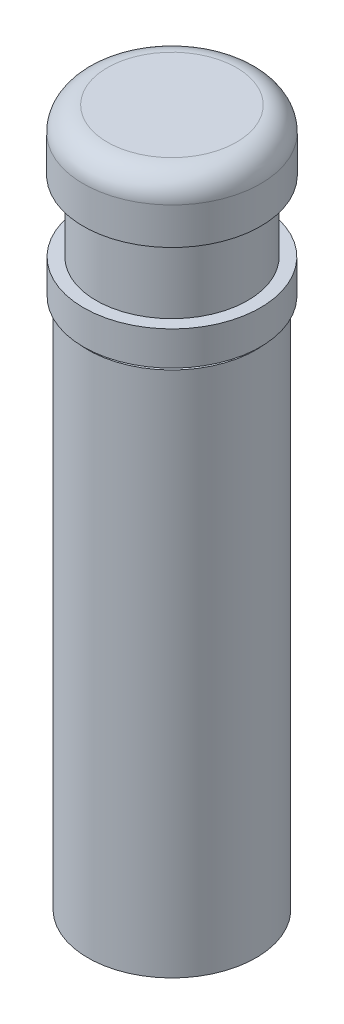
ISO-10303-21;
HEADER;
FILE_DESCRIPTION(('STEP AP214'),'2;1');
FILE_NAME('part.step','',(''),(''),'','','');
FILE_SCHEMA(('AUTOMOTIVE_DESIGN { 1 0 10303 214 1 1 1 1 }'));
ENDSEC;
DATA;
#1=APPLICATION_CONTEXT('core data for automotive mechanical design processes');
#2=APPLICATION_PROTOCOL_DEFINITION('international standard','automotive_design',2000,#1);
#3=PRODUCT_CONTEXT('',#1,'mechanical');
#4=PRODUCT('Part','Part','',(#3));
#5=PRODUCT_RELATED_PRODUCT_CATEGORY('part','',(#4));
#6=PRODUCT_DEFINITION_FORMATION('','',#4);
#7=PRODUCT_DEFINITION_CONTEXT('part definition',#1,'design');
#8=PRODUCT_DEFINITION('design','',#6,#7);
#9=PRODUCT_DEFINITION_SHAPE('','',#8);
#10=(LENGTH_UNIT() NAMED_UNIT(*) SI_UNIT(.MILLI.,.METRE.));
#11=(NAMED_UNIT(*) PLANE_ANGLE_UNIT() SI_UNIT($,.RADIAN.));
#12=(NAMED_UNIT(*) SI_UNIT($,.STERADIAN.) SOLID_ANGLE_UNIT());
#13=UNCERTAINTY_MEASURE_WITH_UNIT(LENGTH_MEASURE(1.E-05),#10,'distance_accuracy_value','');
#14=(GEOMETRIC_REPRESENTATION_CONTEXT(3) GLOBAL_UNCERTAINTY_ASSIGNED_CONTEXT((#13)) GLOBAL_UNIT_ASSIGNED_CONTEXT((#10,
#11,#12)) REPRESENTATION_CONTEXT('',''));
#15=CARTESIAN_POINT('',(0.,0.,0.));
#16=DIRECTION('',(0.,0.,1.));
#17=DIRECTION('',(1.,0.,0.));
#18=AXIS2_PLACEMENT_3D('',#15,#16,#17);
#19=CARTESIAN_POINT('',(0.,58.,5.37817102384318));
#20=DIRECTION('',(0.,-1.,0.));
#21=DIRECTION('',(0.,0.,-1.));
#22=AXIS2_PLACEMENT_3D('',#19,#20,#21);
#23=PLANE('',#22);
#24=CARTESIAN_POINT('',(0.,58.,0.));
#25=DIRECTION('',(0.,-1.,0.));
#26=DIRECTION('',(0.,0.,-1.));
#27=AXIS2_PLACEMENT_3D('',#24,#25,#26);
#28=CIRCLE('',#27,5.37817102384318);
#29=CARTESIAN_POINT('',(0.,58.,-5.37817102384318));
#30=VERTEX_POINT('',#29);
#31=EDGE_CURVE('E10',#30,#30,#28,.T.);
#32=ORIENTED_EDGE('',*,*,#31,.F.);
#33=EDGE_LOOP('',(#32));
#34=FACE_BOUND('',#33,.T.);
#35=ADVANCED_FACE('F33',(#34),#23,.F.);
#36=CARTESIAN_POINT('',(0.,56.,0.));
#37=DIRECTION('',(0.,-1.,0.));
#38=DIRECTION('',(0.,0.,-1.));
#39=AXIS2_PLACEMENT_3D('',#36,#37,#38);
#40=TOROIDAL_SURFACE('',#39,5.37817102384318,2.);
#41=CARTESIAN_POINT('',(0.,56.,0.));
#42=DIRECTION('',(0.,-1.,0.));
#43=DIRECTION('',(0.,0.,-1.));
#44=AXIS2_PLACEMENT_3D('',#41,#42,#43);
#45=CIRCLE('',#44,7.37817102384318);
#46=CARTESIAN_POINT('',(0.,56.,-7.37817102384318));
#47=VERTEX_POINT('',#46);
#48=EDGE_CURVE('E39',#47,#47,#45,.T.);
#49=ORIENTED_EDGE('',*,*,#48,.F.);
#50=EDGE_LOOP('',(#49));
#51=FACE_BOUND('',#50,.T.);
#52=ORIENTED_EDGE('',*,*,#31,.T.);
#53=EDGE_LOOP('',(#52));
#54=FACE_BOUND('',#53,.T.);
#55=ADVANCED_FACE('F126',(#51,#54),#40,.T.);
#56=CARTESIAN_POINT('',(0.,0.,0.));
#57=DIRECTION('',(0.,-1.,0.));
#58=DIRECTION('',(0.,0.,-1.));
#59=AXIS2_PLACEMENT_3D('',#56,#57,#58);
#60=CYLINDRICAL_SURFACE('',#59,7.37817102384318);
#61=CARTESIAN_POINT('',(0.,52.933330122629,0.));
#62=DIRECTION('',(0.,-1.,0.));
#63=DIRECTION('',(0.,0.,-1.));
#64=AXIS2_PLACEMENT_3D('',#61,#62,#63);
#65=CIRCLE('',#64,7.37817102384318);
#66=CARTESIAN_POINT('',(0.,52.933330122629,-7.37817102384318));
#67=VERTEX_POINT('',#66);
#68=EDGE_CURVE('E43',#67,#67,#65,.T.);
#69=ORIENTED_EDGE('',*,*,#68,.F.);
#70=EDGE_LOOP('',(#69));
#71=FACE_BOUND('',#70,.T.);
#72=ORIENTED_EDGE('',*,*,#48,.T.);
#73=EDGE_LOOP('',(#72));
#74=FACE_BOUND('',#73,.T.);
#75=ADVANCED_FACE('F121',(#71,#74),#60,.T.);
#76=CARTESIAN_POINT('',(0.,52.933330122629,6.30936461133419));
#77=DIRECTION('',(0.,1.,0.));
#78=DIRECTION('',(0.,0.,1.));
#79=AXIS2_PLACEMENT_3D('',#76,#77,#78);
#80=PLANE('',#79);
#81=CARTESIAN_POINT('',(0.,52.933330122629,0.));
#82=DIRECTION('',(0.,-1.,0.));
#83=DIRECTION('',(0.,0.,-1.));
#84=AXIS2_PLACEMENT_3D('',#81,#82,#83);
#85=CIRCLE('',#84,6.30936461133419);
#86=CARTESIAN_POINT('',(0.,52.933330122629,-6.30936461133419));
#87=VERTEX_POINT('',#86);
#88=EDGE_CURVE('E47',#87,#87,#85,.T.);
#89=ORIENTED_EDGE('',*,*,#88,.F.);
#90=EDGE_LOOP('',(#89));
#91=FACE_BOUND('',#90,.T.);
#92=ORIENTED_EDGE('',*,*,#68,.T.);
#93=EDGE_LOOP('',(#92));
#94=FACE_BOUND('',#93,.T.);
#95=ADVANCED_FACE('F115',(#91,#94),#80,.F.);
#96=CARTESIAN_POINT('',(0.,0.,0.));
#97=DIRECTION('',(0.,-1.,0.));
#98=DIRECTION('',(0.,0.,-1.));
#99=AXIS2_PLACEMENT_3D('',#96,#97,#98);
#100=CYLINDRICAL_SURFACE('',#99,6.30936461133419);
#101=CARTESIAN_POINT('',(0.,47.0483185325194,0.));
#102=DIRECTION('',(0.,-1.,0.));
#103=DIRECTION('',(0.,0.,-1.));
#104=AXIS2_PLACEMENT_3D('',#101,#102,#103);
#105=CIRCLE('',#104,6.30936461133419);
#106=CARTESIAN_POINT('',(0.,47.0483185325194,-6.30936461133419));
#107=VERTEX_POINT('',#106);
#108=EDGE_CURVE('E52',#107,#107,#105,.T.);
#109=ORIENTED_EDGE('',*,*,#108,.F.);
#110=EDGE_LOOP('',(#109));
#111=FACE_BOUND('',#110,.T.);
#112=ORIENTED_EDGE('',*,*,#88,.T.);
#113=EDGE_LOOP('',(#112));
#114=FACE_BOUND('',#113,.T.);
#115=ADVANCED_FACE('F109',(#111,#114),#100,.T.);
#116=CARTESIAN_POINT('',(0.,47.0483185325194,7.35482945256619));
#117=DIRECTION('',(0.,-1.,0.));
#118=DIRECTION('',(0.,0.,-1.));
#119=AXIS2_PLACEMENT_3D('',#116,#117,#118);
#120=PLANE('',#119);
#121=CARTESIAN_POINT('',(0.,47.0483185325194,0.));
#122=DIRECTION('',(0.,-1.,0.));
#123=DIRECTION('',(0.,0.,-1.));
#124=AXIS2_PLACEMENT_3D('',#121,#122,#123);
#125=CIRCLE('',#124,7.35482945256619);
#126=CARTESIAN_POINT('',(0.,47.0483185325194,-7.35482945256619));
#127=VERTEX_POINT('',#126);
#128=EDGE_CURVE('E55',#127,#127,#125,.T.);
#129=ORIENTED_EDGE('',*,*,#128,.F.);
#130=EDGE_LOOP('',(#129));
#131=FACE_BOUND('',#130,.T.);
#132=ORIENTED_EDGE('',*,*,#108,.T.);
#133=EDGE_LOOP('',(#132));
#134=FACE_BOUND('',#133,.T.);
#135=ADVANCED_FACE('F103',(#131,#134),#120,.F.);
#136=CARTESIAN_POINT('',(0.,0.,0.));
#137=DIRECTION('',(0.,-1.,0.));
#138=DIRECTION('',(0.,0.,-1.));
#139=AXIS2_PLACEMENT_3D('',#136,#137,#138);
#140=CYLINDRICAL_SURFACE('',#139,7.35482945256619);
#141=CARTESIAN_POINT('',(0.,44.220608724552,0.));
#142=DIRECTION('',(0.,-1.,0.));
#143=DIRECTION('',(0.,0.,-1.));
#144=AXIS2_PLACEMENT_3D('',#141,#142,#143);
#145=CIRCLE('',#144,7.35482945256619);
#146=CARTESIAN_POINT('',(0.,44.220608724552,-7.35482945256619));
#147=VERTEX_POINT('',#146);
#148=EDGE_CURVE('E58',#147,#147,#145,.T.);
#149=ORIENTED_EDGE('',*,*,#148,.F.);
#150=EDGE_LOOP('',(#149));
#151=FACE_BOUND('',#150,.T.);
#152=ORIENTED_EDGE('',*,*,#128,.T.);
#153=EDGE_LOOP('',(#152));
#154=FACE_BOUND('',#153,.T.);
#155=ADVANCED_FACE('F97',(#151,#154),#140,.T.);
#156=CARTESIAN_POINT('',(0.,44.220608724552,6.30936461133419));
#157=DIRECTION('',(0.,1.,0.));
#158=DIRECTION('',(0.,0.,1.));
#159=AXIS2_PLACEMENT_3D('',#156,#157,#158);
#160=PLANE('',#159);
#161=CARTESIAN_POINT('',(0.,44.220608724552,0.));
#162=DIRECTION('',(0.,-1.,0.));
#163=DIRECTION('',(0.,0.,-1.));
#164=AXIS2_PLACEMENT_3D('',#161,#162,#163);
#165=CIRCLE('',#164,6.30936461133419);
#166=CARTESIAN_POINT('',(0.,44.220608724552,-6.30936461133419));
#167=VERTEX_POINT('',#166);
#168=EDGE_CURVE('E61',#167,#167,#165,.T.);
#169=ORIENTED_EDGE('',*,*,#168,.F.);
#170=EDGE_LOOP('',(#169));
#171=FACE_BOUND('',#170,.T.);
#172=ORIENTED_EDGE('',*,*,#148,.T.);
#173=EDGE_LOOP('',(#172));
#174=FACE_BOUND('',#173,.T.);
#175=ADVANCED_FACE('F91',(#171,#174),#160,.F.);
#176=CARTESIAN_POINT('',(0.,0.,0.));
#177=DIRECTION('',(0.,-1.,0.));
#178=DIRECTION('',(0.,0.,-1.));
#179=AXIS2_PLACEMENT_3D('',#176,#177,#178);
#180=CYLINDRICAL_SURFACE('',#179,6.30936461133419);
#181=CARTESIAN_POINT('',(0.,43.8356448780115,0.));
#182=DIRECTION('',(0.,-1.,0.));
#183=DIRECTION('',(0.,0.,-1.));
#184=AXIS2_PLACEMENT_3D('',#181,#182,#183);
#185=CIRCLE('',#184,6.30936461133419);
#186=CARTESIAN_POINT('',(0.,43.8356448780115,-6.30936461133419));
#187=VERTEX_POINT('',#186);
#188=EDGE_CURVE('E64',#187,#187,#185,.T.);
#189=ORIENTED_EDGE('',*,*,#188,.F.);
#190=EDGE_LOOP('',(#189));
#191=FACE_BOUND('',#190,.T.);
#192=ORIENTED_EDGE('',*,*,#168,.T.);
#193=EDGE_LOOP('',(#192));
#194=FACE_BOUND('',#193,.T.);
#195=ADVANCED_FACE('F85',(#191,#194),#180,.T.);
#196=CARTESIAN_POINT('',(0.,43.8356448780115,7.));
#197=DIRECTION('',(0.,-1.,0.));
#198=DIRECTION('',(0.,0.,-1.));
#199=AXIS2_PLACEMENT_3D('',#196,#197,#198);
#200=PLANE('',#199);
#201=CARTESIAN_POINT('',(0.,43.8356448780115,0.));
#202=DIRECTION('',(0.,-1.,0.));
#203=DIRECTION('',(0.,0.,-1.));
#204=AXIS2_PLACEMENT_3D('',#201,#202,#203);
#205=CIRCLE('',#204,7.);
#206=CARTESIAN_POINT('',(0.,43.8356448780115,-7.));
#207=VERTEX_POINT('',#206);
#208=EDGE_CURVE('E67',#207,#207,#205,.T.);
#209=ORIENTED_EDGE('',*,*,#208,.F.);
#210=EDGE_LOOP('',(#209));
#211=FACE_BOUND('',#210,.T.);
#212=ORIENTED_EDGE('',*,*,#188,.T.);
#213=EDGE_LOOP('',(#212));
#214=FACE_BOUND('',#213,.T.);
#215=ADVANCED_FACE('F79',(#211,#214),#200,.F.);
#216=CARTESIAN_POINT('',(0.,0.,0.));
#217=DIRECTION('',(0.,-1.,0.));
#218=DIRECTION('',(0.,0.,-1.));
#219=AXIS2_PLACEMENT_3D('',#216,#217,#218);
#220=CYLINDRICAL_SURFACE('',#219,7.);
#221=CARTESIAN_POINT('',(0.,0.,0.));
#222=DIRECTION('',(0.,-1.,0.));
#223=DIRECTION('',(0.,0.,-1.));
#224=AXIS2_PLACEMENT_3D('',#221,#222,#223);
#225=CIRCLE('',#224,7.);
#226=CARTESIAN_POINT('',(0.,0.,-7.));
#227=VERTEX_POINT('',#226);
#228=EDGE_CURVE('E70',#227,#227,#225,.T.);
#229=ORIENTED_EDGE('',*,*,#228,.F.);
#230=EDGE_LOOP('',(#229));
#231=FACE_BOUND('',#230,.T.);
#232=ORIENTED_EDGE('',*,*,#208,.T.);
#233=EDGE_LOOP('',(#232));
#234=FACE_BOUND('',#233,.T.);
#235=ADVANCED_FACE('F76',(#231,#234),#220,.T.);
#236=CARTESIAN_POINT('',(0.,0.,7.));
#237=DIRECTION('',(0.,1.,0.));
#238=DIRECTION('',(0.,0.,1.));
#239=AXIS2_PLACEMENT_3D('',#236,#237,#238);
#240=PLANE('',#239);
#241=ORIENTED_EDGE('',*,*,#228,.T.);
#242=EDGE_LOOP('',(#241));
#243=FACE_BOUND('',#242,.T.);
#244=ADVANCED_FACE('F74',(#243),#240,.F.);
#245=CLOSED_SHELL('',(#35,#55,#75,#95,#115,#135,#155,#175,#195,#215,#235,#244));
#246=MANIFOLD_SOLID_BREP('B2',#245);
#247=ADVANCED_BREP_SHAPE_REPRESENTATION('',(#18,#246),#14);
#248=SHAPE_DEFINITION_REPRESENTATION(#9,#247);
ENDSEC;
END-ISO-10303-21;
